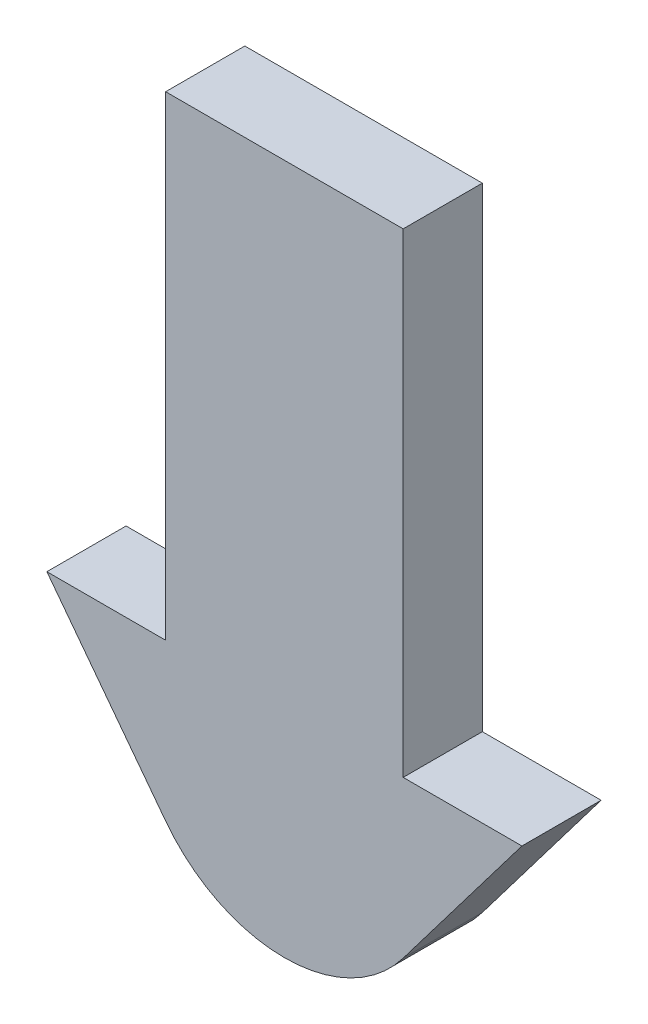
ISO-10303-21;
HEADER;
FILE_DESCRIPTION(('STEP AP214'),'2;1');
FILE_NAME('part.step','',(''),(''),'','','');
FILE_SCHEMA(('AUTOMOTIVE_DESIGN { 1 0 10303 214 1 1 1 1 }'));
ENDSEC;
DATA;
#1=APPLICATION_CONTEXT('core data for automotive mechanical design processes');
#2=APPLICATION_PROTOCOL_DEFINITION('international standard','automotive_design',2000,#1);
#3=PRODUCT_CONTEXT('',#1,'mechanical');
#4=PRODUCT('Part','Part','',(#3));
#5=PRODUCT_RELATED_PRODUCT_CATEGORY('part','',(#4));
#6=PRODUCT_DEFINITION_FORMATION('','',#4);
#7=PRODUCT_DEFINITION_CONTEXT('part definition',#1,'design');
#8=PRODUCT_DEFINITION('design','',#6,#7);
#9=PRODUCT_DEFINITION_SHAPE('','',#8);
#10=(LENGTH_UNIT() NAMED_UNIT(*) SI_UNIT(.MILLI.,.METRE.));
#11=(NAMED_UNIT(*) PLANE_ANGLE_UNIT() SI_UNIT($,.RADIAN.));
#12=(NAMED_UNIT(*) SI_UNIT($,.STERADIAN.) SOLID_ANGLE_UNIT());
#13=UNCERTAINTY_MEASURE_WITH_UNIT(LENGTH_MEASURE(1.E-05),#10,'distance_accuracy_value','');
#14=(GEOMETRIC_REPRESENTATION_CONTEXT(3) GLOBAL_UNCERTAINTY_ASSIGNED_CONTEXT((#13)) GLOBAL_UNIT_ASSIGNED_CONTEXT((#10,
#11,#12)) REPRESENTATION_CONTEXT('',''));
#15=CARTESIAN_POINT('',(0.,0.,0.));
#16=DIRECTION('',(0.,0.,1.));
#17=DIRECTION('',(1.,0.,0.));
#18=AXIS2_PLACEMENT_3D('',#15,#16,#17);
#19=CARTESIAN_POINT('',(-15.,90.,10.));
#20=DIRECTION('',(1.,0.,0.));
#21=DIRECTION('',(0.,0.,-1.));
#22=AXIS2_PLACEMENT_3D('',#19,#20,#21);
#23=PLANE('',#22);
#24=DIRECTION('',(0.,-1.,0.));
#25=VECTOR('',#24,1.);
#26=CARTESIAN_POINT('',(-15.,90.,0.));
#27=LINE('',#26,#25);
#28=CARTESIAN_POINT('',(-15.,90.,0.));
#29=VERTEX_POINT('',#28);
#30=CARTESIAN_POINT('',(-15.,30.,0.));
#31=VERTEX_POINT('',#30);
#32=EDGE_CURVE('E133',#29,#31,#27,.T.);
#33=ORIENTED_EDGE('',*,*,#32,.T.);
#34=DIRECTION('',(0.,0.,-1.));
#35=VECTOR('',#34,1.);
#36=CARTESIAN_POINT('',(-15.,30.,10.));
#37=LINE('',#36,#35);
#38=CARTESIAN_POINT('',(-15.,30.,10.));
#39=VERTEX_POINT('',#38);
#40=EDGE_CURVE('E11',#39,#31,#37,.T.);
#41=ORIENTED_EDGE('',*,*,#40,.F.);
#42=DIRECTION('',(0.,-1.,0.));
#43=VECTOR('',#42,1.);
#44=CARTESIAN_POINT('',(-15.,90.,10.));
#45=LINE('',#44,#43);
#46=CARTESIAN_POINT('',(-15.,90.,10.));
#47=VERTEX_POINT('',#46);
#48=EDGE_CURVE('E147',#47,#39,#45,.T.);
#49=ORIENTED_EDGE('',*,*,#48,.F.);
#50=DIRECTION('',(0.,0.,-1.));
#51=VECTOR('',#50,1.);
#52=CARTESIAN_POINT('',(-15.,90.,10.));
#53=LINE('',#52,#51);
#54=EDGE_CURVE('E129',#47,#29,#53,.T.);
#55=ORIENTED_EDGE('',*,*,#54,.T.);
#56=EDGE_LOOP('',(#33,#41,#49,#55));
#57=FACE_BOUND('',#56,.T.);
#58=ADVANCED_FACE('F37',(#57),#23,.F.);
#59=CARTESIAN_POINT('',(-15.,30.,10.));
#60=DIRECTION('',(0.,-1.,0.));
#61=DIRECTION('',(0.,0.,-1.));
#62=AXIS2_PLACEMENT_3D('',#59,#60,#61);
#63=PLANE('',#62);
#64=DIRECTION('',(-1.,0.,0.));
#65=VECTOR('',#64,1.);
#66=CARTESIAN_POINT('',(-15.,30.,0.));
#67=LINE('',#66,#65);
#68=CARTESIAN_POINT('',(-30.,30.,0.));
#69=VERTEX_POINT('',#68);
#70=EDGE_CURVE('E136',#31,#69,#67,.T.);
#71=ORIENTED_EDGE('',*,*,#70,.T.);
#72=DIRECTION('',(0.,0.,-1.));
#73=VECTOR('',#72,1.);
#74=CARTESIAN_POINT('',(-30.,30.,10.));
#75=LINE('',#74,#73);
#76=CARTESIAN_POINT('',(-30.,30.,10.));
#77=VERTEX_POINT('',#76);
#78=EDGE_CURVE('E45',#77,#69,#75,.T.);
#79=ORIENTED_EDGE('',*,*,#78,.F.);
#80=DIRECTION('',(-1.,0.,0.));
#81=VECTOR('',#80,1.);
#82=CARTESIAN_POINT('',(-15.,30.,10.));
#83=LINE('',#82,#81);
#84=EDGE_CURVE('E96',#39,#77,#83,.T.);
#85=ORIENTED_EDGE('',*,*,#84,.F.);
#86=ORIENTED_EDGE('',*,*,#40,.T.);
#87=EDGE_LOOP('',(#71,#79,#85,#86));
#88=FACE_BOUND('',#87,.T.);
#89=ADVANCED_FACE('F182',(#88),#63,.F.);
#90=CARTESIAN_POINT('',(-30.,30.,10.));
#91=DIRECTION('',(0.796675190717731,0.604407677395702,0.));
#92=DIRECTION('',(-0.604407677395702,0.796675190717731,0.));
#93=AXIS2_PLACEMENT_3D('',#90,#91,#92);
#94=PLANE('',#93);
#95=DIRECTION('',(0.604407677395702,-0.796675190717731,0.));
#96=VECTOR('',#95,1.);
#97=CARTESIAN_POINT('',(-30.,30.,0.));
#98=LINE('',#97,#96);
#99=CARTESIAN_POINT('',(-15.,10.2283652116115,0.));
#100=VERTEX_POINT('',#99);
#101=EDGE_CURVE('E138',#69,#100,#98,.T.);
#102=ORIENTED_EDGE('',*,*,#101,.T.);
#103=DIRECTION('',(0.,0.,-1.));
#104=VECTOR('',#103,1.);
#105=CARTESIAN_POINT('',(-15.,10.2283652116115,10.));
#106=LINE('',#105,#104);
#107=CARTESIAN_POINT('',(-15.,10.2283652116115,10.));
#108=VERTEX_POINT('',#107);
#109=EDGE_CURVE('E154',#108,#100,#106,.T.);
#110=ORIENTED_EDGE('',*,*,#109,.F.);
#111=DIRECTION('',(0.604407677395702,-0.796675190717731,0.));
#112=VECTOR('',#111,1.);
#113=CARTESIAN_POINT('',(-30.,30.,10.));
#114=LINE('',#113,#112);
#115=EDGE_CURVE('E162',#77,#108,#114,.T.);
#116=ORIENTED_EDGE('',*,*,#115,.F.);
#117=ORIENTED_EDGE('',*,*,#78,.T.);
#118=EDGE_LOOP('',(#102,#110,#116,#117));
#119=FACE_BOUND('',#118,.T.);
#120=ADVANCED_FACE('F160',(#119),#94,.F.);
#121=CARTESIAN_POINT('',(0.,21.6083043217622,10.));
#122=DIRECTION('',(0.,0.,-1.));
#123=DIRECTION('',(-1.,0.,0.));
#124=AXIS2_PLACEMENT_3D('',#121,#122,#123);
#125=CYLINDRICAL_SURFACE('',#124,18.8282504272367);
#126=CARTESIAN_POINT('',(0.,21.6083043217622,0.));
#127=DIRECTION('',(0.,0.,1.));
#128=DIRECTION('',(1.,0.,0.));
#129=AXIS2_PLACEMENT_3D('',#126,#127,#128);
#130=CIRCLE('',#129,18.8282504272367);
#131=CARTESIAN_POINT('',(15.,10.2283652116115,0.));
#132=VERTEX_POINT('',#131);
#133=EDGE_CURVE('E140',#100,#132,#130,.T.);
#134=ORIENTED_EDGE('',*,*,#133,.T.);
#135=DIRECTION('',(0.,0.,-1.));
#136=VECTOR('',#135,1.);
#137=CARTESIAN_POINT('',(15.,10.2283652116115,10.));
#138=LINE('',#137,#136);
#139=CARTESIAN_POINT('',(15.,10.2283652116115,10.));
#140=VERTEX_POINT('',#139);
#141=EDGE_CURVE('E151',#140,#132,#138,.T.);
#142=ORIENTED_EDGE('',*,*,#141,.F.);
#143=CARTESIAN_POINT('',(0.,21.6083043217622,10.));
#144=DIRECTION('',(0.,0.,1.));
#145=DIRECTION('',(1.,0.,0.));
#146=AXIS2_PLACEMENT_3D('',#143,#144,#145);
#147=CIRCLE('',#146,18.8282504272367);
#148=EDGE_CURVE('E174',#108,#140,#147,.T.);
#149=ORIENTED_EDGE('',*,*,#148,.F.);
#150=ORIENTED_EDGE('',*,*,#109,.T.);
#151=EDGE_LOOP('',(#134,#142,#149,#150));
#152=FACE_BOUND('',#151,.T.);
#153=ADVANCED_FACE('F170',(#152),#125,.T.);
#154=CARTESIAN_POINT('',(30.,30.,10.));
#155=DIRECTION('',(-0.796675190717731,0.604407677395702,0.));
#156=DIRECTION('',(-0.604407677395702,-0.796675190717731,0.));
#157=AXIS2_PLACEMENT_3D('',#154,#155,#156);
#158=PLANE('',#157);
#159=DIRECTION('',(0.604407677395702,0.796675190717731,0.));
#160=VECTOR('',#159,1.);
#161=CARTESIAN_POINT('',(30.,30.,0.));
#162=LINE('',#161,#160);
#163=CARTESIAN_POINT('',(30.,30.,0.));
#164=VERTEX_POINT('',#163);
#165=EDGE_CURVE('E142',#132,#164,#162,.T.);
#166=ORIENTED_EDGE('',*,*,#165,.T.);
#167=DIRECTION('',(0.,0.,-1.));
#168=VECTOR('',#167,1.);
#169=CARTESIAN_POINT('',(30.,30.,10.));
#170=LINE('',#169,#168);
#171=CARTESIAN_POINT('',(30.,30.,10.));
#172=VERTEX_POINT('',#171);
#173=EDGE_CURVE('E124',#172,#164,#170,.T.);
#174=ORIENTED_EDGE('',*,*,#173,.F.);
#175=DIRECTION('',(0.604407677395702,0.796675190717731,0.));
#176=VECTOR('',#175,1.);
#177=CARTESIAN_POINT('',(30.,30.,10.));
#178=LINE('',#177,#176);
#179=EDGE_CURVE('E115',#140,#172,#178,.T.);
#180=ORIENTED_EDGE('',*,*,#179,.F.);
#181=ORIENTED_EDGE('',*,*,#141,.T.);
#182=EDGE_LOOP('',(#166,#174,#180,#181));
#183=FACE_BOUND('',#182,.T.);
#184=ADVANCED_FACE('F173',(#183),#158,.F.);
#185=CARTESIAN_POINT('',(15.,30.,10.));
#186=DIRECTION('',(0.,-1.,0.));
#187=DIRECTION('',(0.,0.,-1.));
#188=AXIS2_PLACEMENT_3D('',#185,#186,#187);
#189=PLANE('',#188);
#190=DIRECTION('',(-1.,0.,0.));
#191=VECTOR('',#190,1.);
#192=CARTESIAN_POINT('',(15.,30.,0.));
#193=LINE('',#192,#191);
#194=CARTESIAN_POINT('',(15.,30.,0.));
#195=VERTEX_POINT('',#194);
#196=EDGE_CURVE('E123',#164,#195,#193,.T.);
#197=ORIENTED_EDGE('',*,*,#196,.T.);
#198=DIRECTION('',(0.,0.,-1.));
#199=VECTOR('',#198,1.);
#200=CARTESIAN_POINT('',(15.,30.,10.));
#201=LINE('',#200,#199);
#202=CARTESIAN_POINT('',(15.,30.,10.));
#203=VERTEX_POINT('',#202);
#204=EDGE_CURVE('E120',#203,#195,#201,.T.);
#205=ORIENTED_EDGE('',*,*,#204,.F.);
#206=DIRECTION('',(-1.,0.,0.));
#207=VECTOR('',#206,1.);
#208=CARTESIAN_POINT('',(15.,30.,10.));
#209=LINE('',#208,#207);
#210=EDGE_CURVE('E109',#172,#203,#209,.T.);
#211=ORIENTED_EDGE('',*,*,#210,.F.);
#212=ORIENTED_EDGE('',*,*,#173,.T.);
#213=EDGE_LOOP('',(#197,#205,#211,#212));
#214=FACE_BOUND('',#213,.T.);
#215=ADVANCED_FACE('F121',(#214),#189,.F.);
#216=CARTESIAN_POINT('',(15.,90.,10.));
#217=DIRECTION('',(-1.,0.,0.));
#218=DIRECTION('',(0.,0.,1.));
#219=AXIS2_PLACEMENT_3D('',#216,#217,#218);
#220=PLANE('',#219);
#221=DIRECTION('',(0.,1.,0.));
#222=VECTOR('',#221,1.);
#223=CARTESIAN_POINT('',(15.,90.,0.));
#224=LINE('',#223,#222);
#225=CARTESIAN_POINT('',(15.,90.,0.));
#226=VERTEX_POINT('',#225);
#227=EDGE_CURVE('E82',#195,#226,#224,.T.);
#228=ORIENTED_EDGE('',*,*,#227,.T.);
#229=DIRECTION('',(0.,0.,-1.));
#230=VECTOR('',#229,1.);
#231=CARTESIAN_POINT('',(15.,90.,10.));
#232=LINE('',#231,#230);
#233=CARTESIAN_POINT('',(15.,90.,10.));
#234=VERTEX_POINT('',#233);
#235=EDGE_CURVE('E125',#234,#226,#232,.T.);
#236=ORIENTED_EDGE('',*,*,#235,.F.);
#237=DIRECTION('',(0.,1.,0.));
#238=VECTOR('',#237,1.);
#239=CARTESIAN_POINT('',(15.,90.,10.));
#240=LINE('',#239,#238);
#241=EDGE_CURVE('E113',#203,#234,#240,.T.);
#242=ORIENTED_EDGE('',*,*,#241,.F.);
#243=ORIENTED_EDGE('',*,*,#204,.T.);
#244=EDGE_LOOP('',(#228,#236,#242,#243));
#245=FACE_BOUND('',#244,.T.);
#246=ADVANCED_FACE('F127',(#245),#220,.F.);
#247=CARTESIAN_POINT('',(-15.,90.,10.));
#248=DIRECTION('',(0.,-1.,0.));
#249=DIRECTION('',(0.,0.,-1.));
#250=AXIS2_PLACEMENT_3D('',#247,#248,#249);
#251=PLANE('',#250);
#252=DIRECTION('',(-1.,0.,0.));
#253=VECTOR('',#252,1.);
#254=CARTESIAN_POINT('',(-15.,90.,0.));
#255=LINE('',#254,#253);
#256=EDGE_CURVE('E88',#226,#29,#255,.T.);
#257=ORIENTED_EDGE('',*,*,#256,.T.);
#258=ORIENTED_EDGE('',*,*,#54,.F.);
#259=DIRECTION('',(-1.,0.,0.));
#260=VECTOR('',#259,1.);
#261=CARTESIAN_POINT('',(-15.,90.,10.));
#262=LINE('',#261,#260);
#263=EDGE_CURVE('E53',#234,#47,#262,.T.);
#264=ORIENTED_EDGE('',*,*,#263,.F.);
#265=ORIENTED_EDGE('',*,*,#235,.T.);
#266=EDGE_LOOP('',(#257,#258,#264,#265));
#267=FACE_BOUND('',#266,.T.);
#268=ADVANCED_FACE('F198',(#267),#251,.F.);
#269=CARTESIAN_POINT('',(0.,21.6083043217622,10.));
#270=DIRECTION('',(0.,0.,1.));
#271=DIRECTION('',(1.,0.,0.));
#272=AXIS2_PLACEMENT_3D('',#269,#270,#271);
#273=PLANE('',#272);
#274=ORIENTED_EDGE('',*,*,#48,.T.);
#275=ORIENTED_EDGE('',*,*,#84,.T.);
#276=ORIENTED_EDGE('',*,*,#115,.T.);
#277=ORIENTED_EDGE('',*,*,#148,.T.);
#278=ORIENTED_EDGE('',*,*,#179,.T.);
#279=ORIENTED_EDGE('',*,*,#210,.T.);
#280=ORIENTED_EDGE('',*,*,#241,.T.);
#281=ORIENTED_EDGE('',*,*,#263,.T.);
#282=EDGE_LOOP('',(#274,#275,#276,#277,#278,#279,#280,#281));
#283=FACE_BOUND('',#282,.T.);
#284=ADVANCED_FACE('F111',(#283),#273,.T.);
#285=CARTESIAN_POINT('',(0.,21.6083043217622,0.));
#286=DIRECTION('',(0.,0.,1.));
#287=DIRECTION('',(1.,0.,0.));
#288=AXIS2_PLACEMENT_3D('',#285,#286,#287);
#289=PLANE('',#288);
#290=ORIENTED_EDGE('',*,*,#32,.F.);
#291=ORIENTED_EDGE('',*,*,#256,.F.);
#292=ORIENTED_EDGE('',*,*,#227,.F.);
#293=ORIENTED_EDGE('',*,*,#196,.F.);
#294=ORIENTED_EDGE('',*,*,#165,.F.);
#295=ORIENTED_EDGE('',*,*,#133,.F.);
#296=ORIENTED_EDGE('',*,*,#101,.F.);
#297=ORIENTED_EDGE('',*,*,#70,.F.);
#298=EDGE_LOOP('',(#290,#291,#292,#293,#294,#295,#296,#297));
#299=FACE_BOUND('',#298,.T.);
#300=ADVANCED_FACE('F166',(#299),#289,.F.);
#301=CLOSED_SHELL('',(#58,#89,#120,#153,#184,#215,#246,#268,#284,#300));
#302=MANIFOLD_SOLID_BREP('B2',#301);
#303=ADVANCED_BREP_SHAPE_REPRESENTATION('',(#18,#302),#14);
#304=SHAPE_DEFINITION_REPRESENTATION(#9,#303);
ENDSEC;
END-ISO-10303-21;
